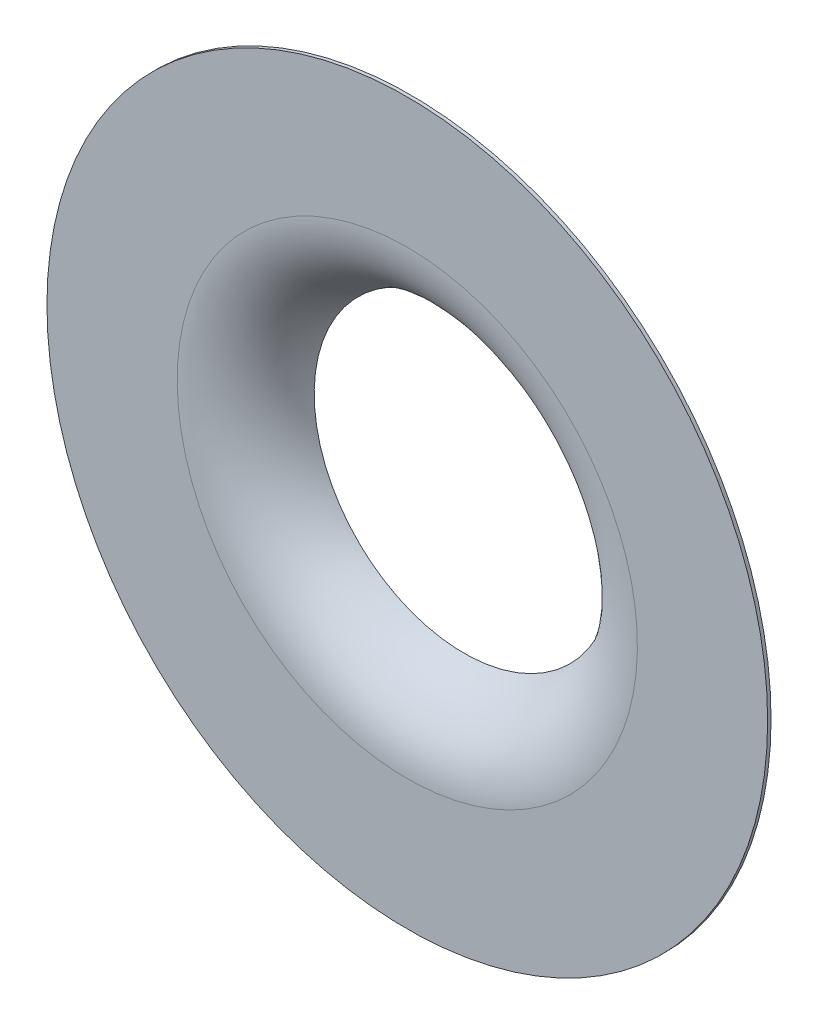
ISO-10303-21;
HEADER;
FILE_DESCRIPTION(('STEP AP214'),'2;1');
FILE_NAME('part.step','',(''),(''),'','','');
FILE_SCHEMA(('AUTOMOTIVE_DESIGN { 1 0 10303 214 1 1 1 1 }'));
ENDSEC;
DATA;
#1=APPLICATION_CONTEXT('core data for automotive mechanical design processes');
#2=APPLICATION_PROTOCOL_DEFINITION('international standard','automotive_design',2000,#1);
#3=PRODUCT_CONTEXT('',#1,'mechanical');
#4=PRODUCT('Part','Part','',(#3));
#5=PRODUCT_RELATED_PRODUCT_CATEGORY('part','',(#4));
#6=PRODUCT_DEFINITION_FORMATION('','',#4);
#7=PRODUCT_DEFINITION_CONTEXT('part definition',#1,'design');
#8=PRODUCT_DEFINITION('design','',#6,#7);
#9=PRODUCT_DEFINITION_SHAPE('','',#8);
#10=(LENGTH_UNIT() NAMED_UNIT(*) SI_UNIT(.MILLI.,.METRE.));
#11=(NAMED_UNIT(*) PLANE_ANGLE_UNIT() SI_UNIT($,.RADIAN.));
#12=(NAMED_UNIT(*) SI_UNIT($,.STERADIAN.) SOLID_ANGLE_UNIT());
#13=UNCERTAINTY_MEASURE_WITH_UNIT(LENGTH_MEASURE(1.E-05),#10,'distance_accuracy_value','');
#14=(GEOMETRIC_REPRESENTATION_CONTEXT(3) GLOBAL_UNCERTAINTY_ASSIGNED_CONTEXT((#13)) GLOBAL_UNIT_ASSIGNED_CONTEXT((#10,
#11,#12)) REPRESENTATION_CONTEXT('',''));
#15=CARTESIAN_POINT('',(0.,0.,0.));
#16=DIRECTION('',(0.,0.,1.));
#17=DIRECTION('',(1.,0.,0.));
#18=AXIS2_PLACEMENT_3D('',#15,#16,#17);
#19=CARTESIAN_POINT('',(0.,0.,-3.));
#20=DIRECTION('',(0.,0.,1.));
#21=DIRECTION('',(1.,0.,0.));
#22=AXIS2_PLACEMENT_3D('',#19,#20,#21);
#23=PLANE('',#22);
#24=CARTESIAN_POINT('',(0.,0.,-3.));
#25=DIRECTION('',(0.,0.,1.));
#26=DIRECTION('',(1.,0.,0.));
#27=AXIS2_PLACEMENT_3D('',#24,#25,#26);
#28=CIRCLE('',#27,202.75);
#29=CARTESIAN_POINT('',(202.75,0.,-3.));
#30=VERTEX_POINT('',#29);
#31=EDGE_CURVE('E56',#30,#30,#28,.T.);
#32=ORIENTED_EDGE('',*,*,#31,.T.);
#33=EDGE_LOOP('',(#32));
#34=FACE_BOUND('',#33,.T.);
#35=CARTESIAN_POINT('',(0.,0.,-3.));
#36=DIRECTION('',(0.,0.,1.));
#37=DIRECTION('',(1.,0.,0.));
#38=AXIS2_PLACEMENT_3D('',#35,#36,#37);
#39=CIRCLE('',#38,317.5);
#40=CARTESIAN_POINT('',(317.5,0.,-3.));
#41=VERTEX_POINT('',#40);
#42=EDGE_CURVE('E11',#41,#41,#39,.T.);
#43=ORIENTED_EDGE('',*,*,#42,.F.);
#44=EDGE_LOOP('',(#43));
#45=FACE_BOUND('',#44,.T.);
#46=ADVANCED_FACE('F37',(#34,#45),#23,.F.);
#47=CARTESIAN_POINT('',(0.,0.,-3.));
#48=DIRECTION('',(0.,0.,1.));
#49=DIRECTION('',(1.,0.,0.));
#50=AXIS2_PLACEMENT_3D('',#47,#48,#49);
#51=CYLINDRICAL_SURFACE('',#50,317.5);
#52=ORIENTED_EDGE('',*,*,#42,.T.);
#53=EDGE_LOOP('',(#52));
#54=FACE_BOUND('',#53,.T.);
#55=CARTESIAN_POINT('',(0.,0.,0.));
#56=DIRECTION('',(0.,0.,1.));
#57=DIRECTION('',(1.,0.,0.));
#58=AXIS2_PLACEMENT_3D('',#55,#56,#57);
#59=CIRCLE('',#58,317.5);
#60=CARTESIAN_POINT('',(317.5,0.,0.));
#61=VERTEX_POINT('',#60);
#62=EDGE_CURVE('E41',#61,#61,#59,.T.);
#63=ORIENTED_EDGE('',*,*,#62,.F.);
#64=EDGE_LOOP('',(#63));
#65=FACE_BOUND('',#64,.T.);
#66=ADVANCED_FACE('F39',(#54,#65),#51,.T.);
#67=CARTESIAN_POINT('',(0.,0.,0.));
#68=DIRECTION('',(0.,0.,1.));
#69=DIRECTION('',(1.,0.,0.));
#70=AXIS2_PLACEMENT_3D('',#67,#68,#69);
#71=PLANE('',#70);
#72=CARTESIAN_POINT('',(0.,0.,0.));
#73=DIRECTION('',(0.,0.,1.));
#74=DIRECTION('',(0.,1.,0.));
#75=AXIS2_PLACEMENT_3D('',#72,#73,#74);
#76=CIRCLE('',#75,202.75);
#77=CARTESIAN_POINT('',(0.,202.75,0.));
#78=VERTEX_POINT('',#77);
#79=EDGE_CURVE('E48',#78,#78,#76,.T.);
#80=ORIENTED_EDGE('',*,*,#79,.F.);
#81=EDGE_LOOP('',(#80));
#82=FACE_BOUND('',#81,.T.);
#83=ORIENTED_EDGE('',*,*,#62,.T.);
#84=EDGE_LOOP('',(#83));
#85=FACE_BOUND('',#84,.T.);
#86=ADVANCED_FACE('F67',(#82,#85),#71,.T.);
#87=CARTESIAN_POINT('',(0.,0.,-75.));
#88=DIRECTION('',(0.,0.,1.));
#89=DIRECTION('',(0.,1.,0.));
#90=AXIS2_PLACEMENT_3D('',#87,#88,#89);
#91=TOROIDAL_SURFACE('',#90,202.75,75.);
#92=ORIENTED_EDGE('',*,*,#79,.T.);
#93=EDGE_LOOP('',(#92));
#94=FACE_BOUND('',#93,.T.);
#95=CARTESIAN_POINT('',(0.,0.,-50.));
#96=DIRECTION('',(0.,0.,1.));
#97=DIRECTION('',(0.,1.,0.));
#98=AXIS2_PLACEMENT_3D('',#95,#96,#97);
#99=CIRCLE('',#98,132.039321881345);
#100=CARTESIAN_POINT('',(0.,132.039321881345,-50.));
#101=VERTEX_POINT('',#100);
#102=EDGE_CURVE('E52',#101,#101,#99,.T.);
#103=ORIENTED_EDGE('',*,*,#102,.F.);
#104=EDGE_LOOP('',(#103));
#105=FACE_BOUND('',#104,.T.);
#106=ADVANCED_FACE('F65',(#94,#105),#91,.T.);
#107=CARTESIAN_POINT('',(0.,0.,-50.));
#108=DIRECTION('',(0.,0.,-1.));
#109=DIRECTION('',(-1.,0.,0.));
#110=AXIS2_PLACEMENT_3D('',#107,#108,#109);
#111=CONICAL_SURFACE('',#110,132.039321881345,1.23095941734077);
#112=ORIENTED_EDGE('',*,*,#102,.T.);
#113=EDGE_LOOP('',(#112));
#114=FACE_BOUND('',#113,.T.);
#115=CARTESIAN_POINT('',(0.,0.,-51.));
#116=DIRECTION('',(0.,0.,1.));
#117=DIRECTION('',(1.,0.,0.));
#118=AXIS2_PLACEMENT_3D('',#115,#116,#117);
#119=CIRCLE('',#118,134.867749006091);
#120=CARTESIAN_POINT('',(134.867749006091,0.,-51.));
#121=VERTEX_POINT('',#120);
#122=EDGE_CURVE('E53',#121,#121,#119,.T.);
#123=ORIENTED_EDGE('',*,*,#122,.F.);
#124=EDGE_LOOP('',(#123));
#125=FACE_BOUND('',#124,.T.);
#126=ADVANCED_FACE('F62',(#114,#125),#111,.F.);
#127=CARTESIAN_POINT('',(0.,0.,-75.));
#128=DIRECTION('',(0.,0.,1.));
#129=DIRECTION('',(0.,1.,0.));
#130=AXIS2_PLACEMENT_3D('',#127,#128,#129);
#131=TOROIDAL_SURFACE('',#130,202.75,72.);
#132=ORIENTED_EDGE('',*,*,#31,.F.);
#133=EDGE_LOOP('',(#132));
#134=FACE_BOUND('',#133,.T.);
#135=ORIENTED_EDGE('',*,*,#122,.T.);
#136=EDGE_LOOP('',(#135));
#137=FACE_BOUND('',#136,.T.);
#138=ADVANCED_FACE('F74',(#134,#137),#131,.F.);
#139=CLOSED_SHELL('',(#46,#66,#86,#106,#126,#138));
#140=MANIFOLD_SOLID_BREP('B2',#139);
#141=ADVANCED_BREP_SHAPE_REPRESENTATION('',(#18,#140),#14);
#142=SHAPE_DEFINITION_REPRESENTATION(#9,#141);
ENDSEC;
END-ISO-10303-21;
